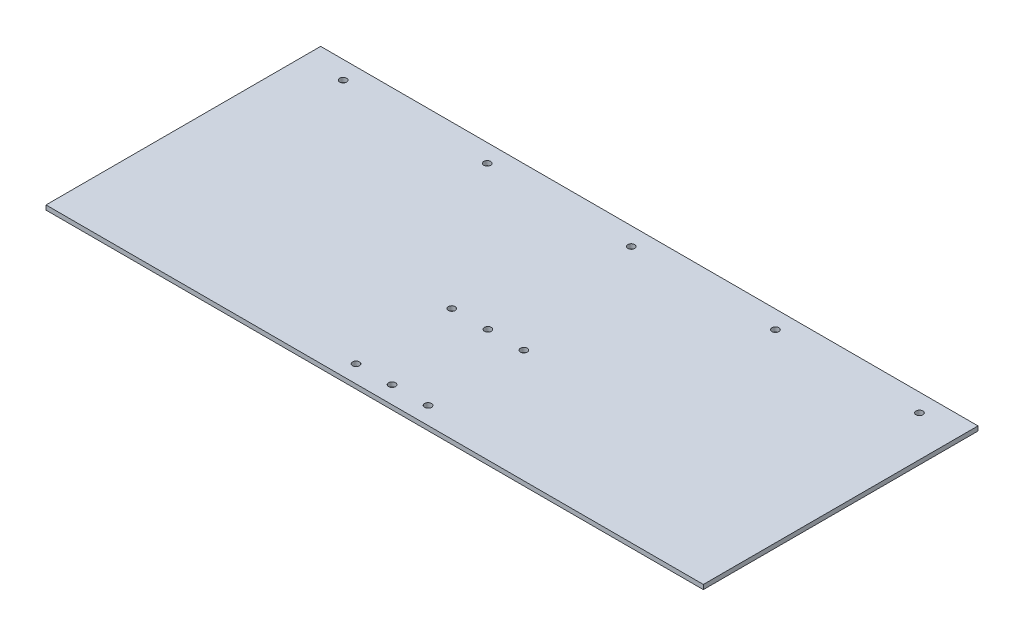
ISO-10303-21;
HEADER;
FILE_DESCRIPTION(('STEP AP214'),'2;1');
FILE_NAME('part.step','',(''),(''),'','','');
FILE_SCHEMA(('AUTOMOTIVE_DESIGN { 1 0 10303 214 1 1 1 1 }'));
ENDSEC;
DATA;
#1=APPLICATION_CONTEXT('core data for automotive mechanical design processes');
#2=APPLICATION_PROTOCOL_DEFINITION('international standard','automotive_design',2000,#1);
#3=PRODUCT_CONTEXT('',#1,'mechanical');
#4=PRODUCT('Part','Part','',(#3));
#5=PRODUCT_RELATED_PRODUCT_CATEGORY('part','',(#4));
#6=PRODUCT_DEFINITION_FORMATION('','',#4);
#7=PRODUCT_DEFINITION_CONTEXT('part definition',#1,'design');
#8=PRODUCT_DEFINITION('design','',#6,#7);
#9=PRODUCT_DEFINITION_SHAPE('','',#8);
#10=(LENGTH_UNIT() NAMED_UNIT(*) SI_UNIT(.MILLI.,.METRE.));
#11=(NAMED_UNIT(*) PLANE_ANGLE_UNIT() SI_UNIT($,.RADIAN.));
#12=(NAMED_UNIT(*) SI_UNIT($,.STERADIAN.) SOLID_ANGLE_UNIT());
#13=UNCERTAINTY_MEASURE_WITH_UNIT(LENGTH_MEASURE(1.E-05),#10,'distance_accuracy_value','');
#14=(GEOMETRIC_REPRESENTATION_CONTEXT(3) GLOBAL_UNCERTAINTY_ASSIGNED_CONTEXT((#13)) GLOBAL_UNIT_ASSIGNED_CONTEXT((#10,
#11,#12)) REPRESENTATION_CONTEXT('',''));
#15=CARTESIAN_POINT('',(0.,0.,0.));
#16=DIRECTION('',(0.,0.,1.));
#17=DIRECTION('',(1.,0.,0.));
#18=AXIS2_PLACEMENT_3D('',#15,#16,#17);
#19=CARTESIAN_POINT('',(0.,3.175,0.));
#20=DIRECTION('',(0.,-1.,0.));
#21=DIRECTION('',(0.,0.,-1.));
#22=AXIS2_PLACEMENT_3D('',#19,#20,#21);
#23=PLANE('',#22);
#24=DIRECTION('',(0.,0.,1.));
#25=VECTOR('',#24,1.);
#26=CARTESIAN_POINT('',(0.,3.175,0.));
#27=LINE('',#26,#25);
#28=CARTESIAN_POINT('',(0.,3.175,-193.675));
#29=VERTEX_POINT('',#28);
#30=CARTESIAN_POINT('',(0.,3.175,0.));
#31=VERTEX_POINT('',#30);
#32=EDGE_CURVE('E85',#29,#31,#27,.T.);
#33=ORIENTED_EDGE('',*,*,#32,.T.);
#34=DIRECTION('',(1.,0.,0.));
#35=VECTOR('',#34,1.);
#36=CARTESIAN_POINT('',(0.,3.175,0.));
#37=LINE('',#36,#35);
#38=CARTESIAN_POINT('',(463.55,3.175,0.));
#39=VERTEX_POINT('',#38);
#40=EDGE_CURVE('E80',#31,#39,#37,.T.);
#41=ORIENTED_EDGE('',*,*,#40,.T.);
#42=DIRECTION('',(0.,0.,-1.));
#43=VECTOR('',#42,1.);
#44=CARTESIAN_POINT('',(463.55,3.175,0.));
#45=LINE('',#44,#43);
#46=CARTESIAN_POINT('',(463.55,3.175,-193.675));
#47=VERTEX_POINT('',#46);
#48=EDGE_CURVE('E83',#39,#47,#45,.T.);
#49=ORIENTED_EDGE('',*,*,#48,.T.);
#50=DIRECTION('',(-1.,0.,0.));
#51=VECTOR('',#50,1.);
#52=CARTESIAN_POINT('',(0.,3.175,-193.675));
#53=LINE('',#52,#51);
#54=EDGE_CURVE('E50',#47,#29,#53,.T.);
#55=ORIENTED_EDGE('',*,*,#54,.T.);
#56=EDGE_LOOP('',(#33,#41,#49,#55));
#57=FACE_BOUND('',#56,.T.);
#58=CARTESIAN_POINT('',(231.775,3.175,-12.2555));
#59=DIRECTION('',(0.,1.,0.));
#60=DIRECTION('',(0.,0.,1.));
#61=AXIS2_PLACEMENT_3D('',#58,#59,#60);
#62=CIRCLE('',#61,2.4257);
#63=CARTESIAN_POINT('',(231.775,3.175,-9.82980000000001));
#64=VERTEX_POINT('',#63);
#65=EDGE_CURVE('E100',#64,#64,#62,.T.);
#66=ORIENTED_EDGE('',*,*,#65,.F.);
#67=EDGE_LOOP('',(#66));
#68=FACE_BOUND('',#67,.T.);
#69=CARTESIAN_POINT('',(257.175,3.175,-12.2555));
#70=DIRECTION('',(0.,1.,0.));
#71=DIRECTION('',(0.,0.,1.));
#72=AXIS2_PLACEMENT_3D('',#69,#70,#71);
#73=CIRCLE('',#72,2.42569999999997);
#74=CARTESIAN_POINT('',(257.175,3.175,-9.82980000000003));
#75=VERTEX_POINT('',#74);
#76=EDGE_CURVE('E115',#75,#75,#73,.T.);
#77=ORIENTED_EDGE('',*,*,#76,.F.);
#78=EDGE_LOOP('',(#77));
#79=FACE_BOUND('',#78,.T.);
#80=CARTESIAN_POINT('',(206.375,3.175,-12.2555));
#81=DIRECTION('',(0.,1.,0.));
#82=DIRECTION('',(0.,0.,-1.));
#83=AXIS2_PLACEMENT_3D('',#80,#81,#82);
#84=CIRCLE('',#83,2.42569999999997);
#85=CARTESIAN_POINT('',(206.375,3.175,-14.6812));
#86=VERTEX_POINT('',#85);
#87=EDGE_CURVE('E121',#86,#86,#84,.T.);
#88=ORIENTED_EDGE('',*,*,#87,.F.);
#89=EDGE_LOOP('',(#88));
#90=FACE_BOUND('',#89,.T.);
#91=CARTESIAN_POINT('',(257.175,3.175,-79.8195));
#92=DIRECTION('',(0.,1.,0.));
#93=DIRECTION('',(0.,0.,-1.));
#94=AXIS2_PLACEMENT_3D('',#91,#92,#93);
#95=CIRCLE('',#94,2.42569999999997);
#96=CARTESIAN_POINT('',(257.175,3.175,-82.2452));
#97=VERTEX_POINT('',#96);
#98=EDGE_CURVE('E127',#97,#97,#95,.T.);
#99=ORIENTED_EDGE('',*,*,#98,.F.);
#100=EDGE_LOOP('',(#99));
#101=FACE_BOUND('',#100,.T.);
#102=CARTESIAN_POINT('',(231.775,3.175,-79.8195));
#103=DIRECTION('',(0.,1.,0.));
#104=DIRECTION('',(0.,0.,-1.));
#105=AXIS2_PLACEMENT_3D('',#102,#103,#104);
#106=CIRCLE('',#105,2.4257);
#107=CARTESIAN_POINT('',(231.775,3.175,-82.2452));
#108=VERTEX_POINT('',#107);
#109=EDGE_CURVE('E133',#108,#108,#106,.T.);
#110=ORIENTED_EDGE('',*,*,#109,.F.);
#111=EDGE_LOOP('',(#110));
#112=FACE_BOUND('',#111,.T.);
#113=CARTESIAN_POINT('',(206.375,3.175,-79.8195));
#114=DIRECTION('',(0.,1.,0.));
#115=DIRECTION('',(0.,0.,1.));
#116=AXIS2_PLACEMENT_3D('',#113,#114,#115);
#117=CIRCLE('',#116,2.42569999999997);
#118=CARTESIAN_POINT('',(206.375,3.175,-77.3938));
#119=VERTEX_POINT('',#118);
#120=EDGE_CURVE('E139',#119,#119,#117,.T.);
#121=ORIENTED_EDGE('',*,*,#120,.F.);
#122=EDGE_LOOP('',(#121));
#123=FACE_BOUND('',#122,.T.);
#124=CARTESIAN_POINT('',(231.775,3.175,-180.975));
#125=DIRECTION('',(0.,1.,0.));
#126=DIRECTION('',(0.,0.,1.));
#127=AXIS2_PLACEMENT_3D('',#124,#125,#126);
#128=CIRCLE('',#127,2.4257);
#129=CARTESIAN_POINT('',(231.775,3.175,-178.5493));
#130=VERTEX_POINT('',#129);
#131=EDGE_CURVE('E145',#130,#130,#128,.T.);
#132=ORIENTED_EDGE('',*,*,#131,.F.);
#133=EDGE_LOOP('',(#132));
#134=FACE_BOUND('',#133,.T.);
#135=CARTESIAN_POINT('',(333.375,3.175,-180.975));
#136=DIRECTION('',(0.,1.,0.));
#137=DIRECTION('',(0.,0.,1.));
#138=AXIS2_PLACEMENT_3D('',#135,#136,#137);
#139=CIRCLE('',#138,2.42569999999997);
#140=CARTESIAN_POINT('',(333.375,3.175,-178.5493));
#141=VERTEX_POINT('',#140);
#142=EDGE_CURVE('E151',#141,#141,#139,.T.);
#143=ORIENTED_EDGE('',*,*,#142,.F.);
#144=EDGE_LOOP('',(#143));
#145=FACE_BOUND('',#144,.T.);
#146=CARTESIAN_POINT('',(434.975,3.175,-180.975));
#147=DIRECTION('',(0.,1.,0.));
#148=DIRECTION('',(0.,0.,1.));
#149=AXIS2_PLACEMENT_3D('',#146,#147,#148);
#150=CIRCLE('',#149,2.42569999999997);
#151=CARTESIAN_POINT('',(434.975,3.175,-178.5493));
#152=VERTEX_POINT('',#151);
#153=EDGE_CURVE('E157',#152,#152,#150,.T.);
#154=ORIENTED_EDGE('',*,*,#153,.F.);
#155=EDGE_LOOP('',(#154));
#156=FACE_BOUND('',#155,.T.);
#157=CARTESIAN_POINT('',(28.575,3.175,-180.975));
#158=DIRECTION('',(0.,1.,0.));
#159=DIRECTION('',(0.,0.,-1.));
#160=AXIS2_PLACEMENT_3D('',#157,#158,#159);
#161=CIRCLE('',#160,2.42569999999997);
#162=CARTESIAN_POINT('',(28.575,3.175,-183.4007));
#163=VERTEX_POINT('',#162);
#164=EDGE_CURVE('E163',#163,#163,#161,.T.);
#165=ORIENTED_EDGE('',*,*,#164,.F.);
#166=EDGE_LOOP('',(#165));
#167=FACE_BOUND('',#166,.T.);
#168=CARTESIAN_POINT('',(130.175,3.175,-180.975));
#169=DIRECTION('',(0.,1.,0.));
#170=DIRECTION('',(0.,0.,-1.));
#171=AXIS2_PLACEMENT_3D('',#168,#169,#170);
#172=CIRCLE('',#171,2.42569999999997);
#173=CARTESIAN_POINT('',(130.175,3.175,-183.4007));
#174=VERTEX_POINT('',#173);
#175=EDGE_CURVE('E169',#174,#174,#172,.T.);
#176=ORIENTED_EDGE('',*,*,#175,.F.);
#177=EDGE_LOOP('',(#176));
#178=FACE_BOUND('',#177,.T.);
#179=ADVANCED_FACE('F33',(#57,#68,#79,#90,#101,#112,#123,#134,#145,#156,#167,#178),#23,.F.);
#180=CARTESIAN_POINT('',(0.,0.,0.));
#181=DIRECTION('',(0.,-1.,0.));
#182=DIRECTION('',(0.,0.,-1.));
#183=AXIS2_PLACEMENT_3D('',#180,#181,#182);
#184=PLANE('',#183);
#185=CARTESIAN_POINT('',(28.575,0.,-180.975));
#186=DIRECTION('',(0.,1.,0.));
#187=DIRECTION('',(0.,0.,-1.));
#188=AXIS2_PLACEMENT_3D('',#185,#186,#187);
#189=CIRCLE('',#188,2.42569999999997);
#190=CARTESIAN_POINT('',(28.575,0.,-183.4007));
#191=VERTEX_POINT('',#190);
#192=EDGE_CURVE('E166',#191,#191,#189,.T.);
#193=ORIENTED_EDGE('',*,*,#192,.T.);
#194=EDGE_LOOP('',(#193));
#195=FACE_BOUND('',#194,.T.);
#196=CARTESIAN_POINT('',(333.375,0.,-180.975));
#197=DIRECTION('',(0.,1.,0.));
#198=DIRECTION('',(0.,0.,1.));
#199=AXIS2_PLACEMENT_3D('',#196,#197,#198);
#200=CIRCLE('',#199,2.42569999999997);
#201=CARTESIAN_POINT('',(333.375,0.,-178.5493));
#202=VERTEX_POINT('',#201);
#203=EDGE_CURVE('E154',#202,#202,#200,.T.);
#204=ORIENTED_EDGE('',*,*,#203,.T.);
#205=EDGE_LOOP('',(#204));
#206=FACE_BOUND('',#205,.T.);
#207=CARTESIAN_POINT('',(206.375,0.,-79.8195));
#208=DIRECTION('',(0.,1.,0.));
#209=DIRECTION('',(0.,0.,1.));
#210=AXIS2_PLACEMENT_3D('',#207,#208,#209);
#211=CIRCLE('',#210,2.42569999999997);
#212=CARTESIAN_POINT('',(206.375,0.,-77.3938));
#213=VERTEX_POINT('',#212);
#214=EDGE_CURVE('E142',#213,#213,#211,.T.);
#215=ORIENTED_EDGE('',*,*,#214,.T.);
#216=EDGE_LOOP('',(#215));
#217=FACE_BOUND('',#216,.T.);
#218=CARTESIAN_POINT('',(257.175,0.,-79.8195));
#219=DIRECTION('',(0.,1.,0.));
#220=DIRECTION('',(0.,0.,-1.));
#221=AXIS2_PLACEMENT_3D('',#218,#219,#220);
#222=CIRCLE('',#221,2.42569999999997);
#223=CARTESIAN_POINT('',(257.175,0.,-82.2452));
#224=VERTEX_POINT('',#223);
#225=EDGE_CURVE('E130',#224,#224,#222,.T.);
#226=ORIENTED_EDGE('',*,*,#225,.T.);
#227=EDGE_LOOP('',(#226));
#228=FACE_BOUND('',#227,.T.);
#229=CARTESIAN_POINT('',(257.175,0.,-12.2555));
#230=DIRECTION('',(0.,1.,0.));
#231=DIRECTION('',(0.,0.,1.));
#232=AXIS2_PLACEMENT_3D('',#229,#230,#231);
#233=CIRCLE('',#232,2.42569999999997);
#234=CARTESIAN_POINT('',(257.175,0.,-9.82980000000003));
#235=VERTEX_POINT('',#234);
#236=EDGE_CURVE('E118',#235,#235,#233,.T.);
#237=ORIENTED_EDGE('',*,*,#236,.T.);
#238=EDGE_LOOP('',(#237));
#239=FACE_BOUND('',#238,.T.);
#240=DIRECTION('',(0.,0.,1.));
#241=VECTOR('',#240,1.);
#242=CARTESIAN_POINT('',(0.,0.,0.));
#243=LINE('',#242,#241);
#244=CARTESIAN_POINT('',(0.,0.,-193.675));
#245=VERTEX_POINT('',#244);
#246=CARTESIAN_POINT('',(0.,0.,0.));
#247=VERTEX_POINT('',#246);
#248=EDGE_CURVE('E97',#245,#247,#243,.T.);
#249=ORIENTED_EDGE('',*,*,#248,.F.);
#250=DIRECTION('',(-1.,0.,0.));
#251=VECTOR('',#250,1.);
#252=CARTESIAN_POINT('',(0.,0.,-193.675));
#253=LINE('',#252,#251);
#254=CARTESIAN_POINT('',(463.55,0.,-193.675));
#255=VERTEX_POINT('',#254);
#256=EDGE_CURVE('E73',#255,#245,#253,.T.);
#257=ORIENTED_EDGE('',*,*,#256,.F.);
#258=DIRECTION('',(0.,0.,-1.));
#259=VECTOR('',#258,1.);
#260=CARTESIAN_POINT('',(463.55,0.,0.));
#261=LINE('',#260,#259);
#262=CARTESIAN_POINT('',(463.55,0.,0.));
#263=VERTEX_POINT('',#262);
#264=EDGE_CURVE('E67',#263,#255,#261,.T.);
#265=ORIENTED_EDGE('',*,*,#264,.F.);
#266=DIRECTION('',(1.,0.,0.));
#267=VECTOR('',#266,1.);
#268=CARTESIAN_POINT('',(0.,0.,0.));
#269=LINE('',#268,#267);
#270=EDGE_CURVE('E89',#247,#263,#269,.T.);
#271=ORIENTED_EDGE('',*,*,#270,.F.);
#272=EDGE_LOOP('',(#249,#257,#265,#271));
#273=FACE_BOUND('',#272,.T.);
#274=CARTESIAN_POINT('',(231.775,0.,-12.2555));
#275=DIRECTION('',(0.,1.,0.));
#276=DIRECTION('',(0.,0.,1.));
#277=AXIS2_PLACEMENT_3D('',#274,#275,#276);
#278=CIRCLE('',#277,2.4257);
#279=CARTESIAN_POINT('',(231.775,0.,-9.82980000000001));
#280=VERTEX_POINT('',#279);
#281=EDGE_CURVE('E112',#280,#280,#278,.T.);
#282=ORIENTED_EDGE('',*,*,#281,.T.);
#283=EDGE_LOOP('',(#282));
#284=FACE_BOUND('',#283,.T.);
#285=CARTESIAN_POINT('',(206.375,0.,-12.2555));
#286=DIRECTION('',(0.,1.,0.));
#287=DIRECTION('',(0.,0.,-1.));
#288=AXIS2_PLACEMENT_3D('',#285,#286,#287);
#289=CIRCLE('',#288,2.42569999999997);
#290=CARTESIAN_POINT('',(206.375,0.,-14.6812));
#291=VERTEX_POINT('',#290);
#292=EDGE_CURVE('E124',#291,#291,#289,.T.);
#293=ORIENTED_EDGE('',*,*,#292,.T.);
#294=EDGE_LOOP('',(#293));
#295=FACE_BOUND('',#294,.T.);
#296=CARTESIAN_POINT('',(231.775,0.,-79.8195));
#297=DIRECTION('',(0.,1.,0.));
#298=DIRECTION('',(0.,0.,-1.));
#299=AXIS2_PLACEMENT_3D('',#296,#297,#298);
#300=CIRCLE('',#299,2.4257);
#301=CARTESIAN_POINT('',(231.775,0.,-82.2452));
#302=VERTEX_POINT('',#301);
#303=EDGE_CURVE('E136',#302,#302,#300,.T.);
#304=ORIENTED_EDGE('',*,*,#303,.T.);
#305=EDGE_LOOP('',(#304));
#306=FACE_BOUND('',#305,.T.);
#307=CARTESIAN_POINT('',(231.775,0.,-180.975));
#308=DIRECTION('',(0.,1.,0.));
#309=DIRECTION('',(0.,0.,1.));
#310=AXIS2_PLACEMENT_3D('',#307,#308,#309);
#311=CIRCLE('',#310,2.4257);
#312=CARTESIAN_POINT('',(231.775,0.,-178.5493));
#313=VERTEX_POINT('',#312);
#314=EDGE_CURVE('E148',#313,#313,#311,.T.);
#315=ORIENTED_EDGE('',*,*,#314,.T.);
#316=EDGE_LOOP('',(#315));
#317=FACE_BOUND('',#316,.T.);
#318=CARTESIAN_POINT('',(434.975,0.,-180.975));
#319=DIRECTION('',(0.,1.,0.));
#320=DIRECTION('',(0.,0.,1.));
#321=AXIS2_PLACEMENT_3D('',#318,#319,#320);
#322=CIRCLE('',#321,2.42569999999997);
#323=CARTESIAN_POINT('',(434.975,0.,-178.5493));
#324=VERTEX_POINT('',#323);
#325=EDGE_CURVE('E160',#324,#324,#322,.T.);
#326=ORIENTED_EDGE('',*,*,#325,.T.);
#327=EDGE_LOOP('',(#326));
#328=FACE_BOUND('',#327,.T.);
#329=CARTESIAN_POINT('',(130.175,0.,-180.975));
#330=DIRECTION('',(0.,1.,0.));
#331=DIRECTION('',(0.,0.,-1.));
#332=AXIS2_PLACEMENT_3D('',#329,#330,#331);
#333=CIRCLE('',#332,2.42569999999997);
#334=CARTESIAN_POINT('',(130.175,0.,-183.4007));
#335=VERTEX_POINT('',#334);
#336=EDGE_CURVE('E172',#335,#335,#333,.T.);
#337=ORIENTED_EDGE('',*,*,#336,.T.);
#338=EDGE_LOOP('',(#337));
#339=FACE_BOUND('',#338,.T.);
#340=ADVANCED_FACE('F108',(#195,#206,#217,#228,#239,#273,#284,#295,#306,#317,#328,#339),#184,.T.);
#341=CARTESIAN_POINT('',(0.,3.175,0.));
#342=DIRECTION('',(1.,0.,0.));
#343=DIRECTION('',(0.,0.,-1.));
#344=AXIS2_PLACEMENT_3D('',#341,#342,#343);
#345=PLANE('',#344);
#346=ORIENTED_EDGE('',*,*,#248,.T.);
#347=DIRECTION('',(0.,-1.,0.));
#348=VECTOR('',#347,1.);
#349=CARTESIAN_POINT('',(0.,3.175,0.));
#350=LINE('',#349,#348);
#351=EDGE_CURVE('E11',#31,#247,#350,.T.);
#352=ORIENTED_EDGE('',*,*,#351,.F.);
#353=ORIENTED_EDGE('',*,*,#32,.F.);
#354=DIRECTION('',(0.,-1.,0.));
#355=VECTOR('',#354,1.);
#356=CARTESIAN_POINT('',(0.,3.175,-193.675));
#357=LINE('',#356,#355);
#358=EDGE_CURVE('E93',#29,#245,#357,.T.);
#359=ORIENTED_EDGE('',*,*,#358,.T.);
#360=EDGE_LOOP('',(#346,#352,#353,#359));
#361=FACE_BOUND('',#360,.T.);
#362=ADVANCED_FACE('F35',(#361),#345,.F.);
#363=CARTESIAN_POINT('',(0.,3.175,0.));
#364=DIRECTION('',(0.,0.,-1.));
#365=DIRECTION('',(-1.,0.,0.));
#366=AXIS2_PLACEMENT_3D('',#363,#364,#365);
#367=PLANE('',#366);
#368=ORIENTED_EDGE('',*,*,#270,.T.);
#369=DIRECTION('',(0.,-1.,0.));
#370=VECTOR('',#369,1.);
#371=CARTESIAN_POINT('',(463.55,3.175,0.));
#372=LINE('',#371,#370);
#373=EDGE_CURVE('E42',#39,#263,#372,.T.);
#374=ORIENTED_EDGE('',*,*,#373,.F.);
#375=ORIENTED_EDGE('',*,*,#40,.F.);
#376=ORIENTED_EDGE('',*,*,#351,.T.);
#377=EDGE_LOOP('',(#368,#374,#375,#376));
#378=FACE_BOUND('',#377,.T.);
#379=ADVANCED_FACE('F88',(#378),#367,.F.);
#380=CARTESIAN_POINT('',(463.55,3.175,0.));
#381=DIRECTION('',(-1.,0.,0.));
#382=DIRECTION('',(0.,0.,1.));
#383=AXIS2_PLACEMENT_3D('',#380,#381,#382);
#384=PLANE('',#383);
#385=ORIENTED_EDGE('',*,*,#264,.T.);
#386=DIRECTION('',(0.,-1.,0.));
#387=VECTOR('',#386,1.);
#388=CARTESIAN_POINT('',(463.55,3.175,-193.675));
#389=LINE('',#388,#387);
#390=EDGE_CURVE('E90',#47,#255,#389,.T.);
#391=ORIENTED_EDGE('',*,*,#390,.F.);
#392=ORIENTED_EDGE('',*,*,#48,.F.);
#393=ORIENTED_EDGE('',*,*,#373,.T.);
#394=EDGE_LOOP('',(#385,#391,#392,#393));
#395=FACE_BOUND('',#394,.T.);
#396=ADVANCED_FACE('F91',(#395),#384,.F.);
#397=CARTESIAN_POINT('',(0.,3.175,-193.675));
#398=DIRECTION('',(0.,0.,1.));
#399=DIRECTION('',(1.,0.,0.));
#400=AXIS2_PLACEMENT_3D('',#397,#398,#399);
#401=PLANE('',#400);
#402=ORIENTED_EDGE('',*,*,#256,.T.);
#403=ORIENTED_EDGE('',*,*,#358,.F.);
#404=ORIENTED_EDGE('',*,*,#54,.F.);
#405=ORIENTED_EDGE('',*,*,#390,.T.);
#406=EDGE_LOOP('',(#402,#403,#404,#405));
#407=FACE_BOUND('',#406,.T.);
#408=ADVANCED_FACE('F105',(#407),#401,.F.);
#409=CARTESIAN_POINT('',(231.775,3.175,-12.2555));
#410=DIRECTION('',(0.,-1.,0.));
#411=DIRECTION('',(0.,0.,-1.));
#412=AXIS2_PLACEMENT_3D('',#409,#410,#411);
#413=CYLINDRICAL_SURFACE('',#412,2.4257);
#414=ORIENTED_EDGE('',*,*,#65,.T.);
#415=EDGE_LOOP('',(#414));
#416=FACE_BOUND('',#415,.T.);
#417=ORIENTED_EDGE('',*,*,#281,.F.);
#418=EDGE_LOOP('',(#417));
#419=FACE_BOUND('',#418,.T.);
#420=ADVANCED_FACE('F189',(#416,#419),#413,.F.);
#421=CARTESIAN_POINT('',(257.175,3.175,-12.2555));
#422=DIRECTION('',(0.,-1.,0.));
#423=DIRECTION('',(0.,0.,-1.));
#424=AXIS2_PLACEMENT_3D('',#421,#422,#423);
#425=CYLINDRICAL_SURFACE('',#424,2.42569999999997);
#426=ORIENTED_EDGE('',*,*,#76,.T.);
#427=EDGE_LOOP('',(#426));
#428=FACE_BOUND('',#427,.T.);
#429=ORIENTED_EDGE('',*,*,#236,.F.);
#430=EDGE_LOOP('',(#429));
#431=FACE_BOUND('',#430,.T.);
#432=ADVANCED_FACE('F235',(#428,#431),#425,.F.);
#433=CARTESIAN_POINT('',(206.375,3.175,-12.2555));
#434=DIRECTION('',(0.,-1.,0.));
#435=DIRECTION('',(0.,0.,-1.));
#436=AXIS2_PLACEMENT_3D('',#433,#434,#435);
#437=CYLINDRICAL_SURFACE('',#436,2.42569999999997);
#438=ORIENTED_EDGE('',*,*,#87,.T.);
#439=EDGE_LOOP('',(#438));
#440=FACE_BOUND('',#439,.T.);
#441=ORIENTED_EDGE('',*,*,#292,.F.);
#442=EDGE_LOOP('',(#441));
#443=FACE_BOUND('',#442,.T.);
#444=ADVANCED_FACE('F243',(#440,#443),#437,.F.);
#445=CARTESIAN_POINT('',(257.175,3.175,-79.8195));
#446=DIRECTION('',(0.,-1.,0.));
#447=DIRECTION('',(0.,0.,-1.));
#448=AXIS2_PLACEMENT_3D('',#445,#446,#447);
#449=CYLINDRICAL_SURFACE('',#448,2.42569999999997);
#450=ORIENTED_EDGE('',*,*,#98,.T.);
#451=EDGE_LOOP('',(#450));
#452=FACE_BOUND('',#451,.T.);
#453=ORIENTED_EDGE('',*,*,#225,.F.);
#454=EDGE_LOOP('',(#453));
#455=FACE_BOUND('',#454,.T.);
#456=ADVANCED_FACE('F251',(#452,#455),#449,.F.);
#457=CARTESIAN_POINT('',(231.775,3.175,-79.8195));
#458=DIRECTION('',(0.,-1.,0.));
#459=DIRECTION('',(0.,0.,-1.));
#460=AXIS2_PLACEMENT_3D('',#457,#458,#459);
#461=CYLINDRICAL_SURFACE('',#460,2.4257);
#462=ORIENTED_EDGE('',*,*,#109,.T.);
#463=EDGE_LOOP('',(#462));
#464=FACE_BOUND('',#463,.T.);
#465=ORIENTED_EDGE('',*,*,#303,.F.);
#466=EDGE_LOOP('',(#465));
#467=FACE_BOUND('',#466,.T.);
#468=ADVANCED_FACE('F260',(#464,#467),#461,.F.);
#469=CARTESIAN_POINT('',(206.375,3.175,-79.8195));
#470=DIRECTION('',(0.,-1.,0.));
#471=DIRECTION('',(0.,0.,-1.));
#472=AXIS2_PLACEMENT_3D('',#469,#470,#471);
#473=CYLINDRICAL_SURFACE('',#472,2.42569999999997);
#474=ORIENTED_EDGE('',*,*,#120,.T.);
#475=EDGE_LOOP('',(#474));
#476=FACE_BOUND('',#475,.T.);
#477=ORIENTED_EDGE('',*,*,#214,.F.);
#478=EDGE_LOOP('',(#477));
#479=FACE_BOUND('',#478,.T.);
#480=ADVANCED_FACE('F269',(#476,#479),#473,.F.);
#481=CARTESIAN_POINT('',(231.775,3.175,-180.975));
#482=DIRECTION('',(0.,-1.,0.));
#483=DIRECTION('',(0.,0.,-1.));
#484=AXIS2_PLACEMENT_3D('',#481,#482,#483);
#485=CYLINDRICAL_SURFACE('',#484,2.4257);
#486=ORIENTED_EDGE('',*,*,#131,.T.);
#487=EDGE_LOOP('',(#486));
#488=FACE_BOUND('',#487,.T.);
#489=ORIENTED_EDGE('',*,*,#314,.F.);
#490=EDGE_LOOP('',(#489));
#491=FACE_BOUND('',#490,.T.);
#492=ADVANCED_FACE('F278',(#488,#491),#485,.F.);
#493=CARTESIAN_POINT('',(333.375,3.175,-180.975));
#494=DIRECTION('',(0.,-1.,0.));
#495=DIRECTION('',(0.,0.,-1.));
#496=AXIS2_PLACEMENT_3D('',#493,#494,#495);
#497=CYLINDRICAL_SURFACE('',#496,2.42569999999997);
#498=ORIENTED_EDGE('',*,*,#142,.T.);
#499=EDGE_LOOP('',(#498));
#500=FACE_BOUND('',#499,.T.);
#501=ORIENTED_EDGE('',*,*,#203,.F.);
#502=EDGE_LOOP('',(#501));
#503=FACE_BOUND('',#502,.T.);
#504=ADVANCED_FACE('F287',(#500,#503),#497,.F.);
#505=CARTESIAN_POINT('',(434.975,3.175,-180.975));
#506=DIRECTION('',(0.,-1.,0.));
#507=DIRECTION('',(0.,0.,-1.));
#508=AXIS2_PLACEMENT_3D('',#505,#506,#507);
#509=CYLINDRICAL_SURFACE('',#508,2.42569999999997);
#510=ORIENTED_EDGE('',*,*,#153,.T.);
#511=EDGE_LOOP('',(#510));
#512=FACE_BOUND('',#511,.T.);
#513=ORIENTED_EDGE('',*,*,#325,.F.);
#514=EDGE_LOOP('',(#513));
#515=FACE_BOUND('',#514,.T.);
#516=ADVANCED_FACE('F296',(#512,#515),#509,.F.);
#517=CARTESIAN_POINT('',(28.575,3.175,-180.975));
#518=DIRECTION('',(0.,-1.,0.));
#519=DIRECTION('',(0.,0.,-1.));
#520=AXIS2_PLACEMENT_3D('',#517,#518,#519);
#521=CYLINDRICAL_SURFACE('',#520,2.42569999999997);
#522=ORIENTED_EDGE('',*,*,#164,.T.);
#523=EDGE_LOOP('',(#522));
#524=FACE_BOUND('',#523,.T.);
#525=ORIENTED_EDGE('',*,*,#192,.F.);
#526=EDGE_LOOP('',(#525));
#527=FACE_BOUND('',#526,.T.);
#528=ADVANCED_FACE('F305',(#524,#527),#521,.F.);
#529=CARTESIAN_POINT('',(130.175,3.175,-180.975));
#530=DIRECTION('',(0.,-1.,0.));
#531=DIRECTION('',(0.,0.,-1.));
#532=AXIS2_PLACEMENT_3D('',#529,#530,#531);
#533=CYLINDRICAL_SURFACE('',#532,2.42569999999997);
#534=ORIENTED_EDGE('',*,*,#175,.T.);
#535=EDGE_LOOP('',(#534));
#536=FACE_BOUND('',#535,.T.);
#537=ORIENTED_EDGE('',*,*,#336,.F.);
#538=EDGE_LOOP('',(#537));
#539=FACE_BOUND('',#538,.T.);
#540=ADVANCED_FACE('F178',(#536,#539),#533,.F.);
#541=CLOSED_SHELL('',(#179,#340,#362,#379,#396,#408,#420,#432,#444,#456,#468,#480,#492,#504,
#516,#528,#540));
#542=MANIFOLD_SOLID_BREP('B2',#541);
#543=ADVANCED_BREP_SHAPE_REPRESENTATION('',(#18,#542),#14);
#544=SHAPE_DEFINITION_REPRESENTATION(#9,#543);
ENDSEC;
END-ISO-10303-21;
